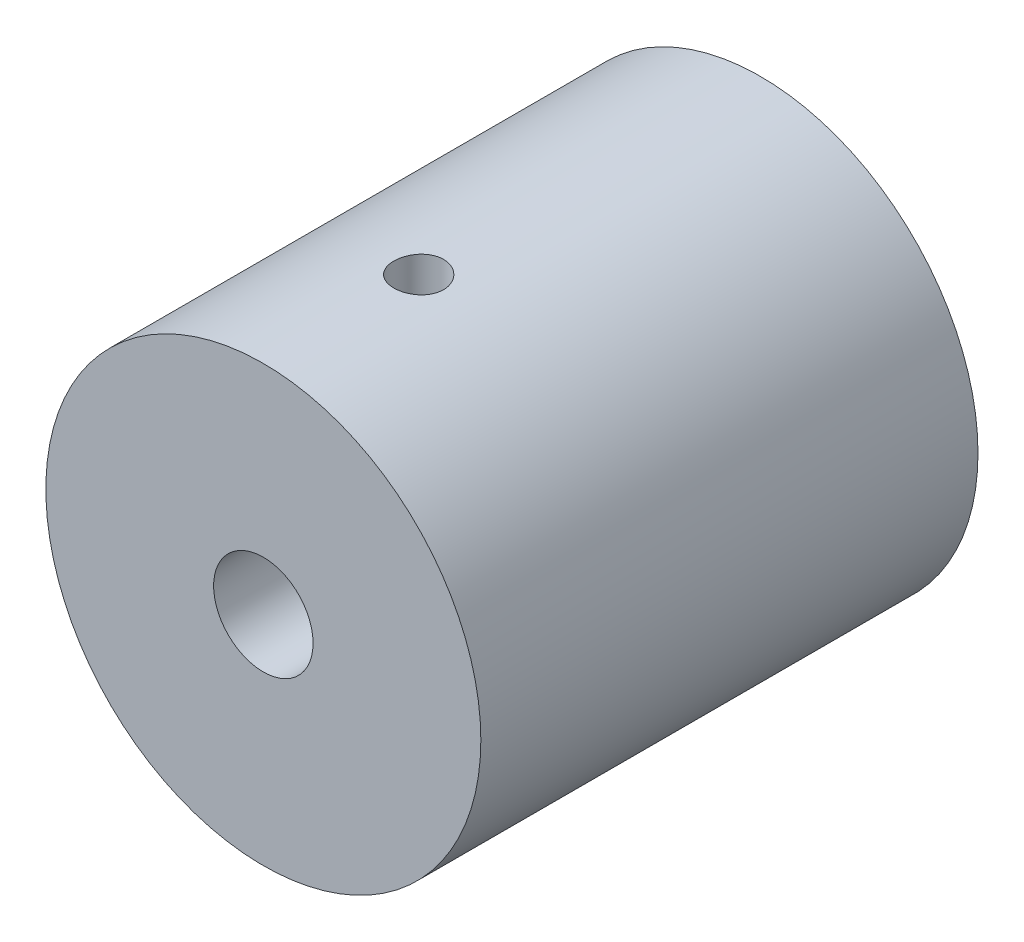
ISO-10303-21;
HEADER;
FILE_DESCRIPTION(('STEP AP214'),'2;1');
FILE_NAME('part.step','',(''),(''),'','','');
FILE_SCHEMA(('AUTOMOTIVE_DESIGN { 1 0 10303 214 1 1 1 1 }'));
ENDSEC;
DATA;
#1=APPLICATION_CONTEXT('core data for automotive mechanical design processes');
#2=APPLICATION_PROTOCOL_DEFINITION('international standard','automotive_design',2000,#1);
#3=PRODUCT_CONTEXT('',#1,'mechanical');
#4=PRODUCT('Part','Part','',(#3));
#5=PRODUCT_RELATED_PRODUCT_CATEGORY('part','',(#4));
#6=PRODUCT_DEFINITION_FORMATION('','',#4);
#7=PRODUCT_DEFINITION_CONTEXT('part definition',#1,'design');
#8=PRODUCT_DEFINITION('design','',#6,#7);
#9=PRODUCT_DEFINITION_SHAPE('','',#8);
#10=(LENGTH_UNIT() NAMED_UNIT(*) SI_UNIT(.MILLI.,.METRE.));
#11=(NAMED_UNIT(*) PLANE_ANGLE_UNIT() SI_UNIT($,.RADIAN.));
#12=(NAMED_UNIT(*) SI_UNIT($,.STERADIAN.) SOLID_ANGLE_UNIT());
#13=UNCERTAINTY_MEASURE_WITH_UNIT(LENGTH_MEASURE(1.E-05),#10,'distance_accuracy_value','');
#14=(GEOMETRIC_REPRESENTATION_CONTEXT(3) GLOBAL_UNCERTAINTY_ASSIGNED_CONTEXT((#13)) GLOBAL_UNIT_ASSIGNED_CONTEXT((#10,
#11,#12)) REPRESENTATION_CONTEXT('',''));
#15=CARTESIAN_POINT('',(0.,0.,0.));
#16=DIRECTION('',(0.,0.,1.));
#17=DIRECTION('',(1.,0.,0.));
#18=AXIS2_PLACEMENT_3D('',#15,#16,#17);
#19=CARTESIAN_POINT('',(0.,0.,10.));
#20=DIRECTION('',(0.,0.,-1.));
#21=DIRECTION('',(-1.,0.,0.));
#22=AXIS2_PLACEMENT_3D('',#19,#20,#21);
#23=CYLINDRICAL_SURFACE('',#22,17.5);
#24=CARTESIAN_POINT('',(0.,0.,0.));
#25=DIRECTION('',(0.,0.,1.));
#26=DIRECTION('',(1.,0.,0.));
#27=AXIS2_PLACEMENT_3D('',#24,#25,#26);
#28=CIRCLE('',#27,17.5);
#29=CARTESIAN_POINT('',(17.5,0.,0.));
#30=VERTEX_POINT('',#29);
#31=EDGE_CURVE('E10',#30,#30,#28,.T.);
#32=ORIENTED_EDGE('',*,*,#31,.T.);
#33=EDGE_LOOP('',(#32));
#34=FACE_BOUND('',#33,.T.);
#35=CARTESIAN_POINT('',(0.,0.,40.));
#36=DIRECTION('',(0.,0.,1.));
#37=DIRECTION('',(1.,0.,0.));
#38=AXIS2_PLACEMENT_3D('',#35,#36,#37);
#39=CIRCLE('',#38,17.5);
#40=CARTESIAN_POINT('',(17.5,0.,40.));
#41=VERTEX_POINT('',#40);
#42=EDGE_CURVE('E49',#41,#41,#39,.T.);
#43=ORIENTED_EDGE('',*,*,#42,.F.);
#44=EDGE_LOOP('',(#43));
#45=FACE_BOUND('',#44,.T.);
#46=CARTESIAN_POINT('',(0.,17.5,25.5));
#47=CARTESIAN_POINT('',(-0.111949281131271,17.4999985510682,25.5000048002778));
#48=CARTESIAN_POINT('',(-0.223970370284167,17.4989143966958,25.5094311530867));
#49=CARTESIAN_POINT('',(-0.444900622583234,17.4946937577693,25.5468888856655));
#50=CARTESIAN_POINT('',(-0.553806324423903,17.4915550764498,25.5749401802739));
#51=CARTESIAN_POINT('',(-0.765274995712128,17.4835792974507,25.6488150604572));
#52=CARTESIAN_POINT('',(-0.867841986694445,17.4787432899077,25.6946272407723));
#53=CARTESIAN_POINT('',(-1.06381060236176,17.4679120331755,25.8026997407102));
#54=CARTESIAN_POINT('',(-1.15721390847253,17.4619169972561,25.8649570350827));
#55=CARTESIAN_POINT('',(-1.33265783514777,17.4494069384049,26.0044617237074));
#56=CARTESIAN_POINT('',(-1.41464987662083,17.4428898679339,26.0817700343795));
#57=CARTESIAN_POINT('',(-1.5645257957997,17.4300869526196,26.2490517563352));
#58=CARTESIAN_POINT('',(-1.63240898570475,17.4238011190613,26.3390257847088));
#59=CARTESIAN_POINT('',(-1.75231750467917,17.4121519566138,26.529395767459));
#60=CARTESIAN_POINT('',(-1.80429797266076,17.4067912557056,26.629820153164));
#61=CARTESIAN_POINT('',(-1.89063905410776,17.3976257108765,26.8380439624315));
#62=CARTESIAN_POINT('',(-1.92500022892039,17.3938208173886,26.9458431509103));
#63=CARTESIAN_POINT('',(-1.97498120601605,17.3882168566912,27.1652558132045));
#64=CARTESIAN_POINT('',(-1.99068245631194,17.3864090748178,27.2768505072263));
#65=CARTESIAN_POINT('',(-2.00314979639016,17.3849772070577,27.5011045934171));
#66=CARTESIAN_POINT('',(-1.99991652712141,17.3853530472536,27.6137639494174));
#67=CARTESIAN_POINT('',(-1.9746735877826,17.3882379876878,27.8363845769511));
#68=CARTESIAN_POINT('',(-1.95275327430006,17.3907369355841,27.9463561307921));
#69=CARTESIAN_POINT('',(-1.89089772862114,17.3975706833085,28.1610493810984));
#70=CARTESIAN_POINT('',(-1.85096218648165,17.4019055147219,28.2657709872065));
#71=CARTESIAN_POINT('',(-1.75411258690629,17.4119342022004,28.4672714090633));
#72=CARTESIAN_POINT('',(-1.697159329054,17.4176311898808,28.5640312212313));
#73=CARTESIAN_POINT('',(-1.5679190891396,17.4297397716759,28.7466532927437));
#74=CARTESIAN_POINT('',(-1.49563152051157,17.4361513931222,28.8325151350196));
#75=CARTESIAN_POINT('',(-1.33727766100704,17.4490120091816,28.9914228916927));
#76=CARTESIAN_POINT('',(-1.25113428048549,17.455461005996,29.0643920069767));
#77=CARTESIAN_POINT('',(-1.06778054344645,17.4676349914203,29.1948462536218));
#78=CARTESIAN_POINT('',(-0.970570168013121,17.4733599787928,29.2523313585169));
#79=CARTESIAN_POINT('',(-0.767785399909197,17.4834436495983,29.3501844179875));
#80=CARTESIAN_POINT('',(-0.662208868897604,17.4878019823021,29.3905479795388));
#81=CARTESIAN_POINT('',(-0.445716005555922,17.4946579437091,29.4529533503239));
#82=CARTESIAN_POINT('',(-0.334799882177867,17.4971556451608,29.4749958758915));
#83=CARTESIAN_POINT('',(-0.111440847189141,17.4999995196358,29.5000348919418));
#84=CARTESIAN_POINT('',(0.000990049263886335,17.5003576527763,29.5031372594291));
#85=CARTESIAN_POINT('',(0.22477014321453,17.4989142301576,29.4904867007736));
#86=CARTESIAN_POINT('',(0.336119359859265,17.4971127126976,29.4747341090033));
#87=CARTESIAN_POINT('',(0.554265994438544,17.4915599395696,29.4249086964044));
#88=CARTESIAN_POINT('',(0.6610749957154,17.4878140135584,29.390885945634));
#89=CARTESIAN_POINT('',(0.867470606546542,17.4787921749894,29.3055377776234));
#90=CARTESIAN_POINT('',(0.967057008006428,17.4735162183709,29.2542118620924));
#91=CARTESIAN_POINT('',(1.1566560556988,17.4619935546906,29.1354552393353));
#92=CARTESIAN_POINT('',(1.24662524248109,17.4557427309721,29.0679555536887));
#93=CARTESIAN_POINT('',(1.41399482686995,17.4429836190554,28.9188656405942));
#94=CARTESIAN_POINT('',(1.49139480973755,17.4364753223705,28.8372749483764));
#95=CARTESIAN_POINT('',(1.63180089287333,17.4238982965486,28.6618546755983));
#96=CARTESIAN_POINT('',(1.69473712215655,17.4178317940395,28.5679689878693));
#97=CARTESIAN_POINT('',(1.80394755942105,17.4068606742744,28.3708980779497));
#98=CARTESIAN_POINT('',(1.85022205420213,17.4019560370195,28.2677130158681));
#99=CARTESIAN_POINT('',(1.92468057699606,17.3938786287494,28.0552042872352));
#100=CARTESIAN_POINT('',(1.9529049884149,17.3907019940762,27.9458949232105));
#101=CARTESIAN_POINT('',(1.99059267414119,17.3864287991637,27.7240499890747));
#102=CARTESIAN_POINT('',(2.00005666745658,17.385332159207,27.6115145427737));
#103=CARTESIAN_POINT('',(1.99994314687055,17.385345163739,27.3871066923611));
#104=CARTESIAN_POINT('',(1.99047539100516,17.3864420908835,27.2752342159769));
#105=CARTESIAN_POINT('',(1.95299850876729,17.3906913968281,27.0546810119119));
#106=CARTESIAN_POINT('',(1.92498937098975,17.3938437768924,26.9460002861945));
#107=CARTESIAN_POINT('',(1.85125733006852,17.4018450488478,26.7349239566378));
#108=CARTESIAN_POINT('',(1.80553879088569,17.4066935227579,26.6325268115905));
#109=CARTESIAN_POINT('',(1.69769666392679,17.4175414489812,26.4368408183938));
#110=CARTESIAN_POINT('',(1.63557300493567,17.4235409062907,26.3435520097863));
#111=CARTESIAN_POINT('',(1.496274276119,17.4360565183282,26.1681688663739));
#112=CARTESIAN_POINT('',(1.41901733601474,17.4425753637158,26.0861397460944));
#113=CARTESIAN_POINT('',(1.25181311513089,17.4553710614581,25.9361657260599));
#114=CARTESIAN_POINT('',(1.16186282631113,17.4616478560018,25.8682241741951));
#115=CARTESIAN_POINT('',(0.971500170550116,17.4732739611811,25.748173827669));
#116=CARTESIAN_POINT('',(0.871055194164787,17.478620234515,25.6961164789324));
#117=CARTESIAN_POINT('',(0.662847939396796,17.4877513427388,25.6096797878848));
#118=CARTESIAN_POINT('',(0.555093898848711,17.4915379025678,25.5752809060603));
#119=CARTESIAN_POINT('',(0.372298085692647,17.4961924479184,25.5335288977349));
#120=CARTESIAN_POINT('',(0.298416630910324,17.4976134605341,25.5209732212439));
#121=CARTESIAN_POINT('',(0.149700818660187,17.499517718344,25.5042071914803));
#122=CARTESIAN_POINT('',(0.0748664667225645,17.5000009689781,25.4999967897977));
#123=CARTESIAN_POINT('',(0.,17.5,25.5));
#124=B_SPLINE_CURVE_WITH_KNOTS('',3,(#46,#47,#48,#49,#50,#51,#52,#53,#54,#55,#56,#57,#58,#59,
#60,#61,#62,#63,#64,#65,#66,#67,#68,#69,#70,#71,#72,#73,#74,#75,#76,#77,#78,#79,#80,#81,#82,#83,
#84,#85,#86,#87,#88,#89,#90,#91,#92,#93,#94,#95,#96,#97,#98,#99,#100,#101,#102,#103,#104,#105,
#106,#107,#108,#109,#110,#111,#112,#113,#114,#115,#116,#117,#118,#119,#120,#121,#122,#123),
.UNSPECIFIED.,.T.,.F.,(4,2,2,2,2,2,2,2,2,2,2,2,2,2,2,2,2,2,2,2,2,2,2,2,2,2,2,2,2,2,2,2,2,2,2,2,
2,2,4),(0.,0.33557441666428,0.671508227518323,1.00722667281621,1.34288340216198,
1.67992799894877,2.01698902267013,2.3549922992977,2.69298480653802,3.0294965400225,
3.36599688237659,3.7008971352324,4.03580315010127,4.3714866496878,4.7071829921089,
5.04481612297898,5.38244983094422,5.72017011621976,6.05787719635448,6.39369472529332,
6.72950629895979,7.06440223033913,7.39930780676431,7.73566795085562,8.07203919137998,
8.41000271890796,8.74796042876379,9.08515935679785,9.42234536116483,9.75758217571838,
10.0928191964809,10.4279736604432,10.763129579344,11.100151413458,11.4372532487619,
11.7754355791757,12.1132428917892,12.3376607387197,12.5620772838218),.UNSPECIFIED.);
#125=CARTESIAN_POINT('',(0.,17.5,25.5));
#126=VERTEX_POINT('',#125);
#127=EDGE_CURVE('E81',#126,#126,#124,.T.);
#128=ORIENTED_EDGE('',*,*,#127,.F.);
#129=EDGE_LOOP('',(#128));
#130=FACE_BOUND('',#129,.T.);
#131=ADVANCED_FACE('F32',(#34,#45,#130),#23,.T.);
#132=CARTESIAN_POINT('',(0.,0.,0.));
#133=DIRECTION('',(0.,0.,1.));
#134=DIRECTION('',(1.,0.,0.));
#135=AXIS2_PLACEMENT_3D('',#132,#133,#134);
#136=CYLINDRICAL_SURFACE('',#135,4.);
#137=CARTESIAN_POINT('',(0.,0.,13.4615384615385));
#138=DIRECTION('',(0.,0.,-1.));
#139=DIRECTION('',(-1.,0.,0.));
#140=AXIS2_PLACEMENT_3D('',#137,#138,#139);
#141=CIRCLE('',#140,4.);
#142=CARTESIAN_POINT('',(-4.,0.,13.4615384615385));
#143=VERTEX_POINT('',#142);
#144=EDGE_CURVE('E52',#143,#143,#141,.T.);
#145=ORIENTED_EDGE('',*,*,#144,.T.);
#146=EDGE_LOOP('',(#145));
#147=FACE_BOUND('',#146,.T.);
#148=CARTESIAN_POINT('',(0.,0.,40.));
#149=DIRECTION('',(0.,0.,1.));
#150=DIRECTION('',(1.,0.,0.));
#151=AXIS2_PLACEMENT_3D('',#148,#149,#150);
#152=CIRCLE('',#151,4.);
#153=CARTESIAN_POINT('',(4.,0.,40.));
#154=VERTEX_POINT('',#153);
#155=EDGE_CURVE('E55',#154,#154,#152,.T.);
#156=ORIENTED_EDGE('',*,*,#155,.T.);
#157=EDGE_LOOP('',(#156));
#158=FACE_BOUND('',#157,.T.);
#159=CARTESIAN_POINT('',(0.,4.,25.5));
#160=CARTESIAN_POINT('',(0.105143925902468,3.99999426810082,25.5000066046344));
#161=CARTESIAN_POINT('',(0.210413199395126,3.99580982039513,25.5083401462421));
#162=CARTESIAN_POINT('',(0.417840470537793,3.97948312074314,25.5413057606831));
#163=CARTESIAN_POINT('',(0.51999217342726,3.96732575657839,25.5659687859956));
#164=CARTESIAN_POINT('',(0.717867089760899,3.93632558806751,25.6303876172333));
#165=CARTESIAN_POINT('',(0.813613605878293,3.91750878355075,25.6700847684959));
#166=CARTESIAN_POINT('',(0.996945233613198,3.87491553031523,25.76314124273));
#167=CARTESIAN_POINT('',(1.08453098798012,3.8511394726705,25.8164994884977));
#168=CARTESIAN_POINT('',(1.25501563552382,3.79912516516124,25.9390344989706));
#169=CARTESIAN_POINT('',(1.33731042224422,3.77070398255074,26.0089729584793));
#170=CARTESIAN_POINT('',(1.48955888973396,3.71319940493486,26.1610429584941));
#171=CARTESIAN_POINT('',(1.55950316621354,3.68411552418069,26.2431837035449));
#172=CARTESIAN_POINT('',(1.69050400090056,3.62597902394695,26.4249666990468));
#173=CARTESIAN_POINT('',(1.75045067110327,3.59710373940264,26.5254721966918));
#174=CARTESIAN_POINT('',(1.85233645378139,3.54571957544641,26.7367346719724));
#175=CARTESIAN_POINT('',(1.89428842993267,3.52320615213979,26.8474842574455));
#176=CARTESIAN_POINT('',(1.95626488437718,3.48915734075617,27.0693302108438));
#177=CARTESIAN_POINT('',(1.97745171416088,3.47704543167427,27.1800089041348));
#178=CARTESIAN_POINT('',(2.00085398661769,3.46363779897055,27.403957675559));
#179=CARTESIAN_POINT('',(2.00308817674615,3.46233138686576,27.5172250817423));
#180=CARTESIAN_POINT('',(1.98937457434459,3.47021860514497,27.7285720486307));
#181=CARTESIAN_POINT('',(1.97556911907364,3.47817527324027,27.8268480624461));
#182=CARTESIAN_POINT('',(1.93387969811387,3.501524574677,28.0194438187461));
#183=CARTESIAN_POINT('',(1.9059912477953,3.51691957663552,28.1137622906106));
#184=CARTESIAN_POINT('',(1.83641956077201,3.55374952825482,28.2984582651313));
#185=CARTESIAN_POINT('',(1.79443013423199,3.57531681327997,28.3886927975716));
#186=CARTESIAN_POINT('',(1.69808337533601,3.62206808562807,28.56126858518));
#187=CARTESIAN_POINT('',(1.64372048762494,3.64725369560381,28.6436062712002));
#188=CARTESIAN_POINT('',(1.51613210982558,3.70226315806571,28.8090425054865));
#189=CARTESIAN_POINT('',(1.44138891673856,3.73227020473492,28.8909137471523));
#190=CARTESIAN_POINT('',(1.27911115748275,3.79095246600814,29.0414708371818));
#191=CARTESIAN_POINT('',(1.19157051314857,3.81962703917602,29.1101503840678));
#192=CARTESIAN_POINT('',(1.0010330116637,3.87403974565928,29.2353713220595));
#193=CARTESIAN_POINT('',(0.897507183198817,3.89957968324014,29.2912009448915));
#194=CARTESIAN_POINT('',(0.680932430977592,3.94315762242485,29.384194058086));
#195=CARTESIAN_POINT('',(0.567891152530551,3.96120157887106,29.4213723700303));
#196=CARTESIAN_POINT('',(0.345532983321404,3.98648667482871,29.4729508074334));
#197=CARTESIAN_POINT('',(0.236683061096652,3.9944987660262,29.4889824714936));
#198=CARTESIAN_POINT('',(0.0175591998987032,4.00146026918207,29.502929462269));
#199=CARTESIAN_POINT('',(-0.092714039739817,4.00041397442637,29.5008533712789));
#200=CARTESIAN_POINT('',(-0.302465943971973,3.9898238450687,29.4795866231625));
#201=CARTESIAN_POINT('',(-0.402118816099859,3.98094491376337,29.46173493454));
#202=CARTESIAN_POINT('',(-0.596813784603882,3.95644342629681,29.4115238562098));
#203=CARTESIAN_POINT('',(-0.691855371382173,3.94082012668824,29.379162867093));
#204=CARTESIAN_POINT('',(-0.877777216899145,3.90368502827176,29.3000030671339));
#205=CARTESIAN_POINT('',(-0.968460794011606,3.88201763539261,29.2528178997674));
#206=CARTESIAN_POINT('',(-1.14092272339854,3.83487948634835,29.1457849287069));
#207=CARTESIAN_POINT('',(-1.22269725955318,3.80940711133877,29.0859317308092));
#208=CARTESIAN_POINT('',(-1.38353537857843,3.75416442672396,28.9484791493386));
#209=CARTESIAN_POINT('',(-1.46154415563805,3.72421769686998,28.8697142631097));
#210=CARTESIAN_POINT('',(-1.60371264223771,3.6652478321764,28.7001496974445));
#211=CARTESIAN_POINT('',(-1.66786277142375,3.63622534800094,28.6093417623042));
#212=CARTESIAN_POINT('',(-1.78341582895804,3.58102384412979,28.4127126916541));
#213=CARTESIAN_POINT('',(-1.8340509916005,3.55505059178121,28.306377467811));
#214=CARTESIAN_POINT('',(-1.91616565186941,3.51148144588269,28.0849798648501));
#215=CARTESIAN_POINT('',(-1.94766983173403,3.493874764435,27.9699289470662));
#216=CARTESIAN_POINT('',(-1.98772337493374,3.47123002051604,27.7461795542306));
#217=CARTESIAN_POINT('',(-1.9981859928109,3.4651476693013,27.6379314931295));
#218=CARTESIAN_POINT('',(-2.0013783087524,3.46330709283206,27.4211058656709));
#219=CARTESIAN_POINT('',(-1.99411569324648,3.4675443925278,27.3125284625243));
#220=CARTESIAN_POINT('',(-1.96385225118662,3.48475724102153,27.1090329969331));
#221=CARTESIAN_POINT('',(-1.94241662868607,3.49686188965317,27.0137990597105));
#222=CARTESIAN_POINT('',(-1.88635071644882,3.52742032375305,26.8283837611513));
#223=CARTESIAN_POINT('',(-1.85171618231984,3.54587615139337,26.7382040358159));
#224=CARTESIAN_POINT('',(-1.76763149060113,3.58857060729071,26.5587502980269));
#225=CARTESIAN_POINT('',(-1.7173422756314,3.61311444791841,26.4699441963419));
#226=CARTESIAN_POINT('',(-1.60430194327478,3.66470663269721,26.3014509276375));
#227=CARTESIAN_POINT('',(-1.54154434248312,3.69175627591221,26.2217685389578));
#228=CARTESIAN_POINT('',(-1.39640665332275,3.74924646316184,26.0637160352906));
#229=CARTESIAN_POINT('',(-1.31256884599452,3.77969966613256,25.9866817952994));
#230=CARTESIAN_POINT('',(-1.13230961246639,3.83755504519861,25.8474740331295));
#231=CARTESIAN_POINT('',(-1.0358814466104,3.8649555725239,25.7853085210602));
#232=CARTESIAN_POINT('',(-0.831863193565893,3.91396019133075,25.6775272745759));
#233=CARTESIAN_POINT('',(-0.724199007553462,3.93552192987866,25.6320316615271));
#234=CARTESIAN_POINT('',(-0.501484202276174,3.97002682597974,25.5603836644852));
#235=CARTESIAN_POINT('',(-0.386455599178201,3.98299446726136,25.5341763063886));
#236=CARTESIAN_POINT('',(-0.22520389298179,3.99390923826956,25.5122051778285));
#237=CARTESIAN_POINT('',(-0.180323758883129,3.99618730680502,25.5076347182673));
#238=CARTESIAN_POINT('',(-0.0903034636101821,3.99923393953631,25.5015306689718));
#239=CARTESIAN_POINT('',(-0.0451632952932559,4.00000246206762,25.4999971630596));
#240=CARTESIAN_POINT('',(0.,4.,25.5));
#241=B_SPLINE_CURVE_WITH_KNOTS('',3,(#159,#160,#161,#162,#163,#164,#165,#166,#167,#168,#169,
#170,#171,#172,#173,#174,#175,#176,#177,#178,#179,#180,#181,#182,#183,#184,#185,#186,#187,#188,
#189,#190,#191,#192,#193,#194,#195,#196,#197,#198,#199,#200,#201,#202,#203,#204,#205,#206,#207,
#208,#209,#210,#211,#212,#213,#214,#215,#216,#217,#218,#219,#220,#221,#222,#223,#224,#225,#226,
#227,#228,#229,#230,#231,#232,#233,#234,#235,#236,#237,#238,#239,#240),.UNSPECIFIED.,.T.,.F.,(4,
2,2,2,2,2,2,2,2,2,2,2,2,2,2,2,2,2,2,2,2,2,2,2,2,2,2,2,2,2,2,2,2,2,2,2,2,2,2,2,4),(0.,
0.315248514840585,0.631096299418396,0.945724310984596,1.26032752116314,1.59396351743618,
1.92785247530807,2.28763452861505,2.64715895796562,2.9851602428046,3.32282714658041,
3.62011424818641,3.91749607851357,4.22180480336975,4.52625042520444,4.86929882667757,
5.21251069197373,5.57166044428882,5.93052433824559,6.25966580942692,6.58865129022952,
6.89213813012244,7.19565843261863,7.50785712055798,7.82018901496679,8.16319221288838,
8.50643177230864,8.86629364323452,9.22569023890902,9.55058615006094,9.87534119729357,
10.1691586049771,10.463070575767,10.7767291356058,11.0905512228726,11.4425048551434,
11.7946476676249,12.1492802732705,12.502898172423,12.6383056026783,12.7737167702213),.UNSPECIFIED.);
#242=CARTESIAN_POINT('',(0.,4.,25.5));
#243=VERTEX_POINT('',#242);
#244=EDGE_CURVE('E36',#243,#243,#241,.T.);
#245=ORIENTED_EDGE('',*,*,#244,.F.);
#246=EDGE_LOOP('',(#245));
#247=FACE_BOUND('',#246,.T.);
#248=ADVANCED_FACE('F78',(#147,#158,#247),#136,.F.);
#249=CARTESIAN_POINT('',(0.,0.,0.));
#250=DIRECTION('',(0.,0.,1.));
#251=DIRECTION('',(1.,0.,0.));
#252=AXIS2_PLACEMENT_3D('',#249,#250,#251);
#253=PLANE('',#252);
#254=CARTESIAN_POINT('',(15.25,0.,0.));
#255=DIRECTION('',(0.,0.,-1.));
#256=DIRECTION('',(-1.,0.,0.));
#257=AXIS2_PLACEMENT_3D('',#254,#255,#256);
#258=CIRCLE('',#257,1.);
#259=CARTESIAN_POINT('',(14.25,0.,0.));
#260=VERTEX_POINT('',#259);
#261=EDGE_CURVE('E66',#260,#260,#258,.T.);
#262=ORIENTED_EDGE('',*,*,#261,.F.);
#263=EDGE_LOOP('',(#262));
#264=FACE_BOUND('',#263,.T.);
#265=CARTESIAN_POINT('',(-15.25,0.,0.));
#266=DIRECTION('',(0.,0.,-1.));
#267=DIRECTION('',(-1.,0.,0.));
#268=AXIS2_PLACEMENT_3D('',#265,#266,#267);
#269=CIRCLE('',#268,1.);
#270=CARTESIAN_POINT('',(-16.25,0.,0.));
#271=VERTEX_POINT('',#270);
#272=EDGE_CURVE('E69',#271,#271,#269,.T.);
#273=ORIENTED_EDGE('',*,*,#272,.F.);
#274=EDGE_LOOP('',(#273));
#275=FACE_BOUND('',#274,.T.);
#276=ORIENTED_EDGE('',*,*,#31,.F.);
#277=EDGE_LOOP('',(#276));
#278=FACE_BOUND('',#277,.T.);
#279=CARTESIAN_POINT('',(0.,0.,0.));
#280=DIRECTION('',(0.,0.,1.));
#281=DIRECTION('',(1.,0.,0.));
#282=AXIS2_PLACEMENT_3D('',#279,#280,#281);
#283=CIRCLE('',#282,13.);
#284=CARTESIAN_POINT('',(13.,0.,0.));
#285=VERTEX_POINT('',#284);
#286=EDGE_CURVE('E44',#285,#285,#283,.T.);
#287=ORIENTED_EDGE('',*,*,#286,.T.);
#288=EDGE_LOOP('',(#287));
#289=FACE_BOUND('',#288,.T.);
#290=ADVANCED_FACE('F115',(#264,#275,#278,#289),#253,.F.);
#291=CARTESIAN_POINT('',(0.,0.,10.));
#292=DIRECTION('',(0.,0.,-1.));
#293=DIRECTION('',(-1.,0.,0.));
#294=AXIS2_PLACEMENT_3D('',#291,#292,#293);
#295=CYLINDRICAL_SURFACE('',#294,13.);
#296=CARTESIAN_POINT('',(0.,0.,10.));
#297=DIRECTION('',(0.,0.,1.));
#298=DIRECTION('',(1.,0.,0.));
#299=AXIS2_PLACEMENT_3D('',#296,#297,#298);
#300=CIRCLE('',#299,13.);
#301=CARTESIAN_POINT('',(-13.,0.,10.));
#302=VERTEX_POINT('',#301);
#303=EDGE_CURVE('E54',#302,#302,#300,.T.);
#304=ORIENTED_EDGE('',*,*,#303,.T.);
#305=EDGE_LOOP('',(#304));
#306=FACE_BOUND('',#305,.T.);
#307=ORIENTED_EDGE('',*,*,#286,.F.);
#308=EDGE_LOOP('',(#307));
#309=FACE_BOUND('',#308,.T.);
#310=ADVANCED_FACE('F121',(#306,#309),#295,.F.);
#311=CARTESIAN_POINT('',(0.,0.,40.));
#312=DIRECTION('',(0.,0.,1.));
#313=DIRECTION('',(1.,0.,0.));
#314=AXIS2_PLACEMENT_3D('',#311,#312,#313);
#315=PLANE('',#314);
#316=ORIENTED_EDGE('',*,*,#155,.F.);
#317=EDGE_LOOP('',(#316));
#318=FACE_BOUND('',#317,.T.);
#319=ORIENTED_EDGE('',*,*,#42,.T.);
#320=EDGE_LOOP('',(#319));
#321=FACE_BOUND('',#320,.T.);
#322=ADVANCED_FACE('F74',(#318,#321),#315,.T.);
#323=CARTESIAN_POINT('',(0.,0.,10.));
#324=DIRECTION('',(0.,0.,-1.));
#325=DIRECTION('',(-1.,0.,0.));
#326=AXIS2_PLACEMENT_3D('',#323,#324,#325);
#327=CONICAL_SURFACE('',#326,13.,1.20362249297668);
#328=CARTESIAN_POINT('',(-4.,0.,13.4615384615385));
#329=CARTESIAN_POINT('',(-4.09375,0.,13.4254807692308));
#330=CARTESIAN_POINT('',(-4.1875,0.,13.3894230769231));
#331=CARTESIAN_POINT('',(-4.375,0.,13.3173076923077));
#332=CARTESIAN_POINT('',(-4.46875,0.,13.28125));
#333=CARTESIAN_POINT('',(-4.65625,0.,13.2091346153846));
#334=CARTESIAN_POINT('',(-4.75,0.,13.1730769230769));
#335=CARTESIAN_POINT('',(-4.9375,0.,13.1009615384615));
#336=CARTESIAN_POINT('',(-5.03125,0.,13.0649038461538));
#337=CARTESIAN_POINT('',(-5.21875,0.,12.9927884615385));
#338=CARTESIAN_POINT('',(-5.3125,0.,12.9567307692308));
#339=CARTESIAN_POINT('',(-5.5,0.,12.8846153846154));
#340=CARTESIAN_POINT('',(-5.59375,0.,12.8485576923077));
#341=CARTESIAN_POINT('',(-5.78125,0.,12.7764423076923));
#342=CARTESIAN_POINT('',(-5.875,0.,12.7403846153846));
#343=CARTESIAN_POINT('',(-6.0625,0.,12.6682692307692));
#344=CARTESIAN_POINT('',(-6.15625,0.,12.6322115384615));
#345=CARTESIAN_POINT('',(-6.34375,0.,12.5600961538462));
#346=CARTESIAN_POINT('',(-6.4375,0.,12.5240384615385));
#347=CARTESIAN_POINT('',(-6.625,0.,12.4519230769231));
#348=CARTESIAN_POINT('',(-6.71875,0.,12.4158653846154));
#349=CARTESIAN_POINT('',(-6.90625,0.,12.34375));
#350=CARTESIAN_POINT('',(-7.,0.,12.3076923076923));
#351=CARTESIAN_POINT('',(-7.1875,0.,12.2355769230769));
#352=CARTESIAN_POINT('',(-7.28125,0.,12.1995192307692));
#353=CARTESIAN_POINT('',(-7.46875,0.,12.1274038461538));
#354=CARTESIAN_POINT('',(-7.5625,0.,12.0913461538462));
#355=CARTESIAN_POINT('',(-7.75,0.,12.0192307692308));
#356=CARTESIAN_POINT('',(-7.84375,0.,11.9831730769231));
#357=CARTESIAN_POINT('',(-8.03125,0.,11.9110576923077));
#358=CARTESIAN_POINT('',(-8.125,0.,11.875));
#359=CARTESIAN_POINT('',(-8.3125,0.,11.8028846153846));
#360=CARTESIAN_POINT('',(-8.40625,0.,11.7668269230769));
#361=CARTESIAN_POINT('',(-8.59375,0.,11.6947115384615));
#362=CARTESIAN_POINT('',(-8.6875,0.,11.6586538461538));
#363=CARTESIAN_POINT('',(-8.875,0.,11.5865384615385));
#364=CARTESIAN_POINT('',(-8.96875,0.,11.5504807692308));
#365=CARTESIAN_POINT('',(-9.15625,0.,11.4783653846154));
#366=CARTESIAN_POINT('',(-9.25,0.,11.4423076923077));
#367=CARTESIAN_POINT('',(-9.4375,0.,11.3701923076923));
#368=CARTESIAN_POINT('',(-9.53125,0.,11.3341346153846));
#369=CARTESIAN_POINT('',(-9.71875,0.,11.2620192307692));
#370=CARTESIAN_POINT('',(-9.8125,0.,11.2259615384615));
#371=CARTESIAN_POINT('',(-10.,0.,11.1538461538462));
#372=CARTESIAN_POINT('',(-10.09375,0.,11.1177884615385));
#373=CARTESIAN_POINT('',(-10.28125,0.,11.0456730769231));
#374=CARTESIAN_POINT('',(-10.375,0.,11.0096153846154));
#375=CARTESIAN_POINT('',(-10.5625,0.,10.9375));
#376=CARTESIAN_POINT('',(-10.65625,0.,10.9014423076923));
#377=CARTESIAN_POINT('',(-10.84375,0.,10.8293269230769));
#378=CARTESIAN_POINT('',(-10.9375,0.,10.7932692307692));
#379=CARTESIAN_POINT('',(-11.125,0.,10.7211538461538));
#380=CARTESIAN_POINT('',(-11.21875,0.,10.6850961538462));
#381=CARTESIAN_POINT('',(-11.40625,0.,10.6129807692308));
#382=CARTESIAN_POINT('',(-11.5,0.,10.5769230769231));
#383=CARTESIAN_POINT('',(-11.6875,0.,10.5048076923077));
#384=CARTESIAN_POINT('',(-11.78125,0.,10.46875));
#385=CARTESIAN_POINT('',(-11.96875,0.,10.3966346153846));
#386=CARTESIAN_POINT('',(-12.0625,0.,10.3605769230769));
#387=CARTESIAN_POINT('',(-12.25,0.,10.2884615384615));
#388=CARTESIAN_POINT('',(-12.34375,0.,10.2524038461538));
#389=CARTESIAN_POINT('',(-12.53125,0.,10.1802884615385));
#390=CARTESIAN_POINT('',(-12.625,0.,10.1442307692308));
#391=CARTESIAN_POINT('',(-12.8125,0.,10.0721153846154));
#392=CARTESIAN_POINT('',(-12.90625,0.,10.0360576923077));
#393=CARTESIAN_POINT('',(-13.,0.,10.));
#394=B_SPLINE_CURVE_WITH_KNOTS('',3,(#328,#329,#330,#331,#332,#333,#334,#335,#336,#337,#338,
#339,#340,#341,#342,#343,#344,#345,#346,#347,#348,#349,#350,#351,#352,#353,#354,#355,#356,#357,
#358,#359,#360,#361,#362,#363,#364,#365,#366,#367,#368,#369,#370,#371,#372,#373,#374,#375,#376,
#377,#378,#379,#380,#381,#382,#383,#384,#385,#386,#387,#388,#389,#390,#391,#392,#393),
.UNSPECIFIED.,.F.,.F.,(4,2,2,2,2,2,2,2,2,2,2,2,2,2,2,2,2,2,2,2,2,2,2,2,2,2,2,2,2,2,2,2,4),(0.,
0.301335323304465,0.602670646608929,0.904005969913394,1.20534129321786,1.50667661652232,
1.80801193982679,2.10934726313125,2.41068258643571,2.71201790974018,3.01335323304464,
3.31468855634911,3.61602387965357,3.91735920295804,4.2186945262625,4.52002984956696,
4.82136517287143,5.12270049617589,5.42403581948036,5.72537114278482,6.02670646608928,
6.32804178939375,6.62937711269821,6.93071243600268,7.23204775930714,7.5333830826116,
7.83471840591607,8.13605372922053,8.437389052525,8.73872437582946,9.04005969913392,
9.34139502243839,9.64273034574285),.UNSPECIFIED.);
#395=EDGE_CURVE('BSEAM110',#143,#302,#394,.T.);
#396=ORIENTED_EDGE('',*,*,#144,.F.);
#397=ORIENTED_EDGE('',*,*,#303,.F.);
#398=ORIENTED_EDGE('',*,*,#395,.T.);
#399=ORIENTED_EDGE('',*,*,#395,.F.);
#400=EDGE_LOOP('',(#396,#398,#397,#399));
#401=FACE_BOUND('',#400,.T.);
#402=ADVANCED_FACE('F110',(#401),#327,.F.);
#403=CARTESIAN_POINT('',(-15.25,0.,10.));
#404=DIRECTION('',(0.,0.,-1.));
#405=DIRECTION('',(-1.,0.,0.));
#406=AXIS2_PLACEMENT_3D('',#403,#404,#405);
#407=CYLINDRICAL_SURFACE('',#406,1.);
#408=CARTESIAN_POINT('',(-15.25,0.,10.));
#409=DIRECTION('',(0.,0.,-1.));
#410=DIRECTION('',(-1.,0.,0.));
#411=AXIS2_PLACEMENT_3D('',#408,#409,#410);
#412=CIRCLE('',#411,1.);
#413=CARTESIAN_POINT('',(-16.25,0.,10.));
#414=VERTEX_POINT('',#413);
#415=EDGE_CURVE('E85',#414,#414,#412,.T.);
#416=ORIENTED_EDGE('',*,*,#415,.F.);
#417=EDGE_LOOP('',(#416));
#418=FACE_BOUND('',#417,.T.);
#419=ORIENTED_EDGE('',*,*,#272,.T.);
#420=EDGE_LOOP('',(#419));
#421=FACE_BOUND('',#420,.T.);
#422=ADVANCED_FACE('F107',(#418,#421),#407,.F.);
#423=CARTESIAN_POINT('',(-15.25,0.,10.));
#424=DIRECTION('',(0.,0.,-1.));
#425=DIRECTION('',(-1.,0.,0.));
#426=AXIS2_PLACEMENT_3D('',#423,#424,#425);
#427=PLANE('',#426);
#428=ORIENTED_EDGE('',*,*,#415,.T.);
#429=EDGE_LOOP('',(#428));
#430=FACE_BOUND('',#429,.T.);
#431=ADVANCED_FACE('F103',(#430),#427,.T.);
#432=CARTESIAN_POINT('',(15.25,0.,10.));
#433=DIRECTION('',(0.,0.,-1.));
#434=DIRECTION('',(-1.,0.,0.));
#435=AXIS2_PLACEMENT_3D('',#432,#433,#434);
#436=CYLINDRICAL_SURFACE('',#435,1.);
#437=CARTESIAN_POINT('',(15.25,0.,10.));
#438=DIRECTION('',(0.,0.,-1.));
#439=DIRECTION('',(-1.,0.,0.));
#440=AXIS2_PLACEMENT_3D('',#437,#438,#439);
#441=CIRCLE('',#440,1.);
#442=CARTESIAN_POINT('',(14.25,0.,10.));
#443=VERTEX_POINT('',#442);
#444=EDGE_CURVE('E61',#443,#443,#441,.T.);
#445=ORIENTED_EDGE('',*,*,#444,.F.);
#446=EDGE_LOOP('',(#445));
#447=FACE_BOUND('',#446,.T.);
#448=ORIENTED_EDGE('',*,*,#261,.T.);
#449=EDGE_LOOP('',(#448));
#450=FACE_BOUND('',#449,.T.);
#451=ADVANCED_FACE('F99',(#447,#450),#436,.F.);
#452=CARTESIAN_POINT('',(15.25,0.,10.));
#453=DIRECTION('',(0.,0.,-1.));
#454=DIRECTION('',(-1.,0.,0.));
#455=AXIS2_PLACEMENT_3D('',#452,#453,#454);
#456=PLANE('',#455);
#457=ORIENTED_EDGE('',*,*,#444,.T.);
#458=EDGE_LOOP('',(#457));
#459=FACE_BOUND('',#458,.T.);
#460=ADVANCED_FACE('F94',(#459),#456,.T.);
#461=CARTESIAN_POINT('',(0.,17.5,27.5));
#462=DIRECTION('',(0.,-1.,0.));
#463=DIRECTION('',(0.,0.,-1.));
#464=AXIS2_PLACEMENT_3D('',#461,#462,#463);
#465=CYLINDRICAL_SURFACE('',#464,2.);
#466=ORIENTED_EDGE('',*,*,#244,.T.);
#467=EDGE_LOOP('',(#466));
#468=FACE_BOUND('',#467,.T.);
#469=ORIENTED_EDGE('',*,*,#127,.T.);
#470=EDGE_LOOP('',(#469));
#471=FACE_BOUND('',#470,.T.);
#472=ADVANCED_FACE('F90',(#468,#471),#465,.F.);
#473=CLOSED_SHELL('',(#131,#248,#290,#310,#322,#402,#422,#431,#451,#460,#472));
#474=MANIFOLD_SOLID_BREP('B2',#473);
#475=ADVANCED_BREP_SHAPE_REPRESENTATION('',(#18,#474),#14);
#476=SHAPE_DEFINITION_REPRESENTATION(#9,#475);
ENDSEC;
END-ISO-10303-21;
